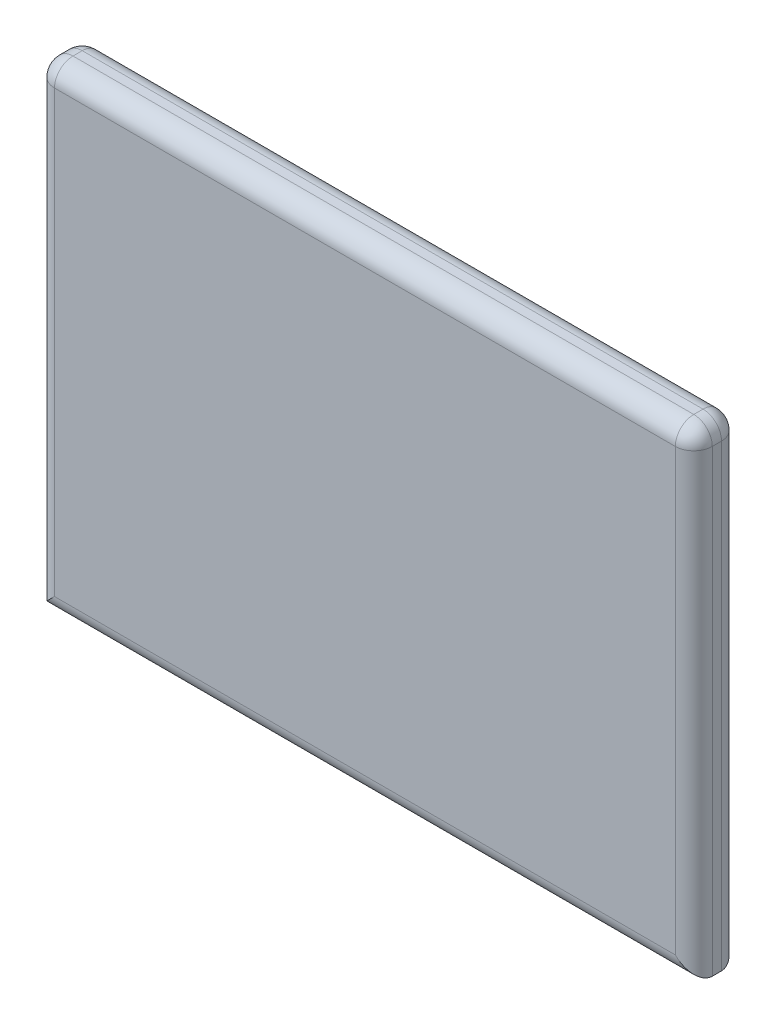
ISO-10303-21;
HEADER;
FILE_DESCRIPTION(('STEP AP214'),'2;1');
FILE_NAME('part.step','',(''),(''),'','','');
FILE_SCHEMA(('AUTOMOTIVE_DESIGN { 1 0 10303 214 1 1 1 1 }'));
ENDSEC;
DATA;
#1=APPLICATION_CONTEXT('core data for automotive mechanical design processes');
#2=APPLICATION_PROTOCOL_DEFINITION('international standard','automotive_design',2000,#1);
#3=PRODUCT_CONTEXT('',#1,'mechanical');
#4=PRODUCT('Part','Part','',(#3));
#5=PRODUCT_RELATED_PRODUCT_CATEGORY('part','',(#4));
#6=PRODUCT_DEFINITION_FORMATION('','',#4);
#7=PRODUCT_DEFINITION_CONTEXT('part definition',#1,'design');
#8=PRODUCT_DEFINITION('design','',#6,#7);
#9=PRODUCT_DEFINITION_SHAPE('','',#8);
#10=(LENGTH_UNIT() NAMED_UNIT(*) SI_UNIT(.MILLI.,.METRE.));
#11=(NAMED_UNIT(*) PLANE_ANGLE_UNIT() SI_UNIT($,.RADIAN.));
#12=(NAMED_UNIT(*) SI_UNIT($,.STERADIAN.) SOLID_ANGLE_UNIT());
#13=UNCERTAINTY_MEASURE_WITH_UNIT(LENGTH_MEASURE(1.E-05),#10,'distance_accuracy_value','');
#14=(GEOMETRIC_REPRESENTATION_CONTEXT(3) GLOBAL_UNCERTAINTY_ASSIGNED_CONTEXT((#13)) GLOBAL_UNIT_ASSIGNED_CONTEXT((#10,
#11,#12)) REPRESENTATION_CONTEXT('',''));
#15=CARTESIAN_POINT('',(0.,0.,0.));
#16=DIRECTION('',(0.,0.,1.));
#17=DIRECTION('',(1.,0.,0.));
#18=AXIS2_PLACEMENT_3D('',#15,#16,#17);
#19=CARTESIAN_POINT('',(-178.,-129.17,25.));
#20=DIRECTION('',(0.,1.,0.));
#21=DIRECTION('',(-1.,0.,0.));
#22=AXIS2_PLACEMENT_3D('',#19,#20,#21);
#23=PLANE('',#22);
#24=DIRECTION('',(1.,0.,0.));
#25=VECTOR('',#24,1.);
#26=CARTESIAN_POINT('',(-178.,-129.17,10.));
#27=LINE('',#26,#25);
#28=CARTESIAN_POINT('',(-178.,-129.17,10.));
#29=VERTEX_POINT('',#28);
#30=CARTESIAN_POINT('',(-100.,-129.17,10.));
#31=VERTEX_POINT('',#30);
#32=EDGE_CURVE('E336',#29,#31,#27,.T.);
#33=ORIENTED_EDGE('',*,*,#32,.T.);
#34=DIRECTION('',(0.,0.,-1.));
#35=VECTOR('',#34,1.);
#36=CARTESIAN_POINT('',(-100.,-129.17,16.5));
#37=LINE('',#36,#35);
#38=CARTESIAN_POINT('',(-100.,-129.17,15.));
#39=VERTEX_POINT('',#38);
#40=EDGE_CURVE('E215',#39,#31,#37,.T.);
#41=ORIENTED_EDGE('',*,*,#40,.F.);
#42=DIRECTION('',(1.,0.,0.));
#43=VECTOR('',#42,1.);
#44=CARTESIAN_POINT('',(-178.,-129.17,15.));
#45=LINE('',#44,#43);
#46=CARTESIAN_POINT('',(-178.,-129.17,15.));
#47=VERTEX_POINT('',#46);
#48=EDGE_CURVE('E331',#39,#47,#45,.F.);
#49=ORIENTED_EDGE('',*,*,#48,.T.);
#50=DIRECTION('',(0.,0.,-1.));
#51=VECTOR('',#50,1.);
#52=CARTESIAN_POINT('',(-178.,-129.17,25.));
#53=LINE('',#52,#51);
#54=EDGE_CURVE('E311',#47,#29,#53,.T.);
#55=ORIENTED_EDGE('',*,*,#54,.T.);
#56=EDGE_LOOP('',(#33,#41,#49,#55));
#57=FACE_BOUND('',#56,.T.);
#58=ADVANCED_FACE('F45',(#57),#23,.F.);
#59=CARTESIAN_POINT('',(-178.,129.17,25.));
#60=DIRECTION('',(1.,0.,0.));
#61=DIRECTION('',(0.,1.,0.));
#62=AXIS2_PLACEMENT_3D('',#59,#60,#61);
#63=PLANE('',#62);
#64=DIRECTION('',(0.,0.,-1.));
#65=VECTOR('',#64,1.);
#66=CARTESIAN_POINT('',(-178.,119.17,25.));
#67=LINE('',#66,#65);
#68=CARTESIAN_POINT('',(-178.,119.17,15.));
#69=VERTEX_POINT('',#68);
#70=CARTESIAN_POINT('',(-178.,119.17,10.));
#71=VERTEX_POINT('',#70);
#72=EDGE_CURVE('E357',#69,#71,#67,.T.);
#73=ORIENTED_EDGE('',*,*,#72,.T.);
#74=DIRECTION('',(0.,-1.,0.));
#75=VECTOR('',#74,1.);
#76=CARTESIAN_POINT('',(-178.,129.17,10.));
#77=LINE('',#76,#75);
#78=EDGE_CURVE('E361',#71,#29,#77,.T.);
#79=ORIENTED_EDGE('',*,*,#78,.T.);
#80=ORIENTED_EDGE('',*,*,#54,.F.);
#81=DIRECTION('',(0.,-1.,0.));
#82=VECTOR('',#81,1.);
#83=CARTESIAN_POINT('',(-178.,129.17,15.));
#84=LINE('',#83,#82);
#85=EDGE_CURVE('E359',#47,#69,#84,.F.);
#86=ORIENTED_EDGE('',*,*,#85,.T.);
#87=EDGE_LOOP('',(#73,#79,#80,#86));
#88=FACE_BOUND('',#87,.T.);
#89=ADVANCED_FACE('F465',(#88),#63,.F.);
#90=CARTESIAN_POINT('',(178.,-129.17,15.));
#91=VERTEX_POINT('',#90);
#92=CARTESIAN_POINT('',(100.,-129.17,15.));
#93=VERTEX_POINT('',#92);
#94=EDGE_CURVE('E332',#91,#93,#45,.F.);
#95=ORIENTED_EDGE('',*,*,#94,.T.);
#96=DIRECTION('',(0.,0.,1.));
#97=VECTOR('',#96,1.);
#98=CARTESIAN_POINT('',(100.,-129.17,16.5));
#99=LINE('',#98,#97);
#100=CARTESIAN_POINT('',(100.,-129.17,10.));
#101=VERTEX_POINT('',#100);
#102=EDGE_CURVE('E213',#101,#93,#99,.T.);
#103=ORIENTED_EDGE('',*,*,#102,.F.);
#104=CARTESIAN_POINT('',(178.,-129.17,10.));
#105=VERTEX_POINT('',#104);
#106=EDGE_CURVE('E335',#101,#105,#27,.T.);
#107=ORIENTED_EDGE('',*,*,#106,.T.);
#108=DIRECTION('',(0.,0.,-1.));
#109=VECTOR('',#108,1.);
#110=CARTESIAN_POINT('',(178.,-129.17,25.));
#111=LINE('',#110,#109);
#112=EDGE_CURVE('E308',#91,#105,#111,.T.);
#113=ORIENTED_EDGE('',*,*,#112,.F.);
#114=EDGE_LOOP('',(#95,#103,#107,#113));
#115=FACE_BOUND('',#114,.T.);
#116=ADVANCED_FACE('F418',(#115),#23,.F.);
#117=CARTESIAN_POINT('',(178.,129.17,25.));
#118=DIRECTION('',(-1.,0.,0.));
#119=DIRECTION('',(0.,-1.,0.));
#120=AXIS2_PLACEMENT_3D('',#117,#118,#119);
#121=PLANE('',#120);
#122=ORIENTED_EDGE('',*,*,#112,.T.);
#123=DIRECTION('',(0.,1.,0.));
#124=VECTOR('',#123,1.);
#125=CARTESIAN_POINT('',(178.,129.17,10.));
#126=LINE('',#125,#124);
#127=CARTESIAN_POINT('',(178.,119.17,10.));
#128=VERTEX_POINT('',#127);
#129=EDGE_CURVE('E319',#105,#128,#126,.T.);
#130=ORIENTED_EDGE('',*,*,#129,.T.);
#131=DIRECTION('',(0.,0.,-1.));
#132=VECTOR('',#131,1.);
#133=CARTESIAN_POINT('',(178.,119.17,25.));
#134=LINE('',#133,#132);
#135=CARTESIAN_POINT('',(178.,119.17,15.));
#136=VERTEX_POINT('',#135);
#137=EDGE_CURVE('E315',#128,#136,#134,.F.);
#138=ORIENTED_EDGE('',*,*,#137,.T.);
#139=DIRECTION('',(0.,1.,0.));
#140=VECTOR('',#139,1.);
#141=CARTESIAN_POINT('',(178.,-129.17,15.));
#142=LINE('',#141,#140);
#143=EDGE_CURVE('E317',#136,#91,#142,.F.);
#144=ORIENTED_EDGE('',*,*,#143,.T.);
#145=EDGE_LOOP('',(#122,#130,#138,#144));
#146=FACE_BOUND('',#145,.T.);
#147=ADVANCED_FACE('F430',(#146),#121,.F.);
#148=CARTESIAN_POINT('',(-178.,129.17,25.));
#149=DIRECTION('',(0.,-1.,0.));
#150=DIRECTION('',(1.,0.,0.));
#151=AXIS2_PLACEMENT_3D('',#148,#149,#150);
#152=PLANE('',#151);
#153=DIRECTION('',(-1.,0.,0.));
#154=VECTOR('',#153,1.);
#155=CARTESIAN_POINT('',(178.,129.17,15.));
#156=LINE('',#155,#154);
#157=CARTESIAN_POINT('',(-168.,129.17,15.));
#158=VERTEX_POINT('',#157);
#159=CARTESIAN_POINT('',(168.,129.17,15.));
#160=VERTEX_POINT('',#159);
#161=EDGE_CURVE('E352',#158,#160,#156,.F.);
#162=ORIENTED_EDGE('',*,*,#161,.T.);
#163=DIRECTION('',(0.,0.,-1.));
#164=VECTOR('',#163,1.);
#165=CARTESIAN_POINT('',(168.,129.17,25.));
#166=LINE('',#165,#164);
#167=CARTESIAN_POINT('',(168.,129.17,10.));
#168=VERTEX_POINT('',#167);
#169=EDGE_CURVE('E355',#160,#168,#166,.T.);
#170=ORIENTED_EDGE('',*,*,#169,.T.);
#171=DIRECTION('',(-1.,0.,0.));
#172=VECTOR('',#171,1.);
#173=CARTESIAN_POINT('',(-178.,129.17,10.));
#174=LINE('',#173,#172);
#175=CARTESIAN_POINT('',(-168.,129.17,10.));
#176=VERTEX_POINT('',#175);
#177=EDGE_CURVE('E350',#168,#176,#174,.T.);
#178=ORIENTED_EDGE('',*,*,#177,.T.);
#179=DIRECTION('',(0.,0.,-1.));
#180=VECTOR('',#179,1.);
#181=CARTESIAN_POINT('',(-168.,129.17,25.));
#182=LINE('',#181,#180);
#183=EDGE_CURVE('E348',#176,#158,#182,.F.);
#184=ORIENTED_EDGE('',*,*,#183,.T.);
#185=EDGE_LOOP('',(#162,#170,#178,#184));
#186=FACE_BOUND('',#185,.T.);
#187=ADVANCED_FACE('F509',(#186),#152,.F.);
#188=CARTESIAN_POINT('',(0.,0.,25.));
#189=DIRECTION('',(0.,0.,1.));
#190=DIRECTION('',(1.,0.,0.));
#191=AXIS2_PLACEMENT_3D('',#188,#189,#190);
#192=PLANE('',#191);
#193=DIRECTION('',(-1.,0.,0.));
#194=VECTOR('',#193,1.);
#195=CARTESIAN_POINT('',(-178.,119.17,25.));
#196=LINE('',#195,#194);
#197=CARTESIAN_POINT('',(168.,119.17,25.));
#198=VERTEX_POINT('',#197);
#199=CARTESIAN_POINT('',(-168.,119.17,25.));
#200=VERTEX_POINT('',#199);
#201=EDGE_CURVE('E341',#198,#200,#196,.T.);
#202=ORIENTED_EDGE('',*,*,#201,.T.);
#203=DIRECTION('',(0.,-1.,0.));
#204=VECTOR('',#203,1.);
#205=CARTESIAN_POINT('',(-168.,-129.17,25.));
#206=LINE('',#205,#204);
#207=CARTESIAN_POINT('',(-168.,-119.17,25.));
#208=VERTEX_POINT('',#207);
#209=EDGE_CURVE('E346',#200,#208,#206,.T.);
#210=ORIENTED_EDGE('',*,*,#209,.T.);
#211=DIRECTION('',(1.,0.,0.));
#212=VECTOR('',#211,1.);
#213=CARTESIAN_POINT('',(178.,-119.17,25.));
#214=LINE('',#213,#212);
#215=CARTESIAN_POINT('',(168.,-119.17,25.));
#216=VERTEX_POINT('',#215);
#217=EDGE_CURVE('E343',#208,#216,#214,.T.);
#218=ORIENTED_EDGE('',*,*,#217,.T.);
#219=DIRECTION('',(0.,1.,0.));
#220=VECTOR('',#219,1.);
#221=CARTESIAN_POINT('',(168.,129.17,25.));
#222=LINE('',#221,#220);
#223=EDGE_CURVE('E339',#216,#198,#222,.T.);
#224=ORIENTED_EDGE('',*,*,#223,.T.);
#225=EDGE_LOOP('',(#202,#210,#218,#224));
#226=FACE_BOUND('',#225,.T.);
#227=ADVANCED_FACE('F444',(#226),#192,.T.);
#228=CARTESIAN_POINT('',(0.,0.,0.));
#229=DIRECTION('',(0.,0.,1.));
#230=DIRECTION('',(1.,0.,0.));
#231=AXIS2_PLACEMENT_3D('',#228,#229,#230);
#232=PLANE('',#231);
#233=DIRECTION('',(1.,0.,0.));
#234=VECTOR('',#233,1.);
#235=CARTESIAN_POINT('',(-155.,101.177924122686,0.));
#236=LINE('',#235,#234);
#237=CARTESIAN_POINT('',(-155.,101.177924122686,0.));
#238=VERTEX_POINT('',#237);
#239=CARTESIAN_POINT('',(-120.,101.177924122686,0.));
#240=VERTEX_POINT('',#239);
#241=EDGE_CURVE('E68',#238,#240,#236,.T.);
#242=ORIENTED_EDGE('',*,*,#241,.F.);
#243=DIRECTION('',(0.,-1.,0.));
#244=VECTOR('',#243,1.);
#245=CARTESIAN_POINT('',(-155.,101.177924122686,0.));
#246=LINE('',#245,#244);
#247=CARTESIAN_POINT('',(-155.,79.0661254575495,0.));
#248=VERTEX_POINT('',#247);
#249=EDGE_CURVE('E777',#238,#248,#246,.T.);
#250=ORIENTED_EDGE('',*,*,#249,.T.);
#251=DIRECTION('',(1.,0.,0.));
#252=VECTOR('',#251,1.);
#253=CARTESIAN_POINT('',(-155.,79.0661254575495,0.));
#254=LINE('',#253,#252);
#255=CARTESIAN_POINT('',(-120.,79.0661254575495,0.));
#256=VERTEX_POINT('',#255);
#257=EDGE_CURVE('E789',#248,#256,#254,.T.);
#258=ORIENTED_EDGE('',*,*,#257,.T.);
#259=DIRECTION('',(0.,-1.,0.));
#260=VECTOR('',#259,1.);
#261=CARTESIAN_POINT('',(-120.,101.177924122686,0.));
#262=LINE('',#261,#260);
#263=EDGE_CURVE('E238',#240,#256,#262,.T.);
#264=ORIENTED_EDGE('',*,*,#263,.F.);
#265=EDGE_LOOP('',(#242,#250,#258,#264));
#266=FACE_BOUND('',#265,.T.);
#267=DIRECTION('',(-1.,0.,0.));
#268=VECTOR('',#267,1.);
#269=CARTESIAN_POINT('',(155.,79.0661254575495,0.));
#270=LINE('',#269,#268);
#271=CARTESIAN_POINT('',(155.,79.0661254575495,0.));
#272=VERTEX_POINT('',#271);
#273=CARTESIAN_POINT('',(120.,79.0661254575495,0.));
#274=VERTEX_POINT('',#273);
#275=EDGE_CURVE('E302',#272,#274,#270,.T.);
#276=ORIENTED_EDGE('',*,*,#275,.F.);
#277=DIRECTION('',(0.,-1.,0.));
#278=VECTOR('',#277,1.);
#279=CARTESIAN_POINT('',(155.,101.177924122686,0.));
#280=LINE('',#279,#278);
#281=CARTESIAN_POINT('',(155.,101.177924122686,0.));
#282=VERTEX_POINT('',#281);
#283=EDGE_CURVE('E277',#282,#272,#280,.T.);
#284=ORIENTED_EDGE('',*,*,#283,.F.);
#285=DIRECTION('',(-1.,0.,0.));
#286=VECTOR('',#285,1.);
#287=CARTESIAN_POINT('',(155.,101.177924122686,0.));
#288=LINE('',#287,#286);
#289=CARTESIAN_POINT('',(120.,101.177924122686,0.));
#290=VERTEX_POINT('',#289);
#291=EDGE_CURVE('E305',#282,#290,#288,.T.);
#292=ORIENTED_EDGE('',*,*,#291,.T.);
#293=DIRECTION('',(0.,-1.,0.));
#294=VECTOR('',#293,1.);
#295=CARTESIAN_POINT('',(120.,101.177924122686,0.));
#296=LINE('',#295,#294);
#297=EDGE_CURVE('E286',#290,#274,#296,.T.);
#298=ORIENTED_EDGE('',*,*,#297,.T.);
#299=EDGE_LOOP('',(#276,#284,#292,#298));
#300=FACE_BOUND('',#299,.T.);
#301=DIRECTION('',(-1.,0.,0.));
#302=VECTOR('',#301,1.);
#303=CARTESIAN_POINT('',(0.,119.17,0.));
#304=LINE('',#303,#302);
#305=CARTESIAN_POINT('',(-168.,119.17,0.));
#306=VERTEX_POINT('',#305);
#307=CARTESIAN_POINT('',(168.,119.17,0.));
#308=VERTEX_POINT('',#307);
#309=EDGE_CURVE('E324',#306,#308,#304,.F.);
#310=ORIENTED_EDGE('',*,*,#309,.T.);
#311=DIRECTION('',(0.,1.,0.));
#312=VECTOR('',#311,1.);
#313=CARTESIAN_POINT('',(168.,0.,0.));
#314=LINE('',#313,#312);
#315=CARTESIAN_POINT('',(168.,-119.17,0.));
#316=VERTEX_POINT('',#315);
#317=EDGE_CURVE('E328',#308,#316,#314,.F.);
#318=ORIENTED_EDGE('',*,*,#317,.T.);
#319=DIRECTION('',(1.,0.,0.));
#320=VECTOR('',#319,1.);
#321=CARTESIAN_POINT('',(0.,-119.17,0.));
#322=LINE('',#321,#320);
#323=CARTESIAN_POINT('',(-168.,-119.17,0.));
#324=VERTEX_POINT('',#323);
#325=EDGE_CURVE('E326',#316,#324,#322,.F.);
#326=ORIENTED_EDGE('',*,*,#325,.T.);
#327=DIRECTION('',(0.,-1.,0.));
#328=VECTOR('',#327,1.);
#329=CARTESIAN_POINT('',(-168.,0.,0.));
#330=LINE('',#329,#328);
#331=EDGE_CURVE('E322',#324,#306,#330,.F.);
#332=ORIENTED_EDGE('',*,*,#331,.T.);
#333=EDGE_LOOP('',(#310,#318,#326,#332));
#334=FACE_BOUND('',#333,.T.);
#335=ADVANCED_FACE('F475',(#266,#300,#334),#232,.F.);
#336=CARTESIAN_POINT('',(-168.,0.,15.));
#337=DIRECTION('',(0.,1.,0.));
#338=DIRECTION('',(-1.,0.,0.));
#339=AXIS2_PLACEMENT_3D('',#336,#337,#338);
#340=CYLINDRICAL_SURFACE('',#339,10.);
#341=CARTESIAN_POINT('',(-168.,119.17,15.));
#342=DIRECTION('',(0.,1.,0.));
#343=DIRECTION('',(0.,0.,1.));
#344=AXIS2_PLACEMENT_3D('',#341,#342,#343);
#345=CIRCLE('',#344,10.);
#346=EDGE_CURVE('E403',#69,#200,#345,.T.);
#347=ORIENTED_EDGE('',*,*,#346,.F.);
#348=ORIENTED_EDGE('',*,*,#85,.F.);
#349=CARTESIAN_POINT('',(-168.,-119.17,15.));
#350=DIRECTION('',(-0.707106781186548,0.707106781186547,0.));
#351=DIRECTION('',(0.707106781186547,0.707106781186548,0.));
#352=AXIS2_PLACEMENT_3D('',#349,#350,#351);
#353=ELLIPSE('',#352,14.1421356237309,10.);
#354=EDGE_CURVE('E312',#208,#47,#353,.F.);
#355=ORIENTED_EDGE('',*,*,#354,.F.);
#356=ORIENTED_EDGE('',*,*,#209,.F.);
#357=EDGE_LOOP('',(#347,#348,#355,#356));
#358=FACE_BOUND('',#357,.T.);
#359=ADVANCED_FACE('F47',(#358),#340,.T.);
#360=CARTESIAN_POINT('',(0.,-119.17,15.));
#361=DIRECTION('',(-1.,0.,0.));
#362=DIRECTION('',(0.,-1.,0.));
#363=AXIS2_PLACEMENT_3D('',#360,#361,#362);
#364=CYLINDRICAL_SURFACE('',#363,10.);
#365=CARTESIAN_POINT('',(-100.,-119.17,15.));
#366=DIRECTION('',(-1.,0.,0.));
#367=DIRECTION('',(0.,-1.,0.));
#368=AXIS2_PLACEMENT_3D('',#365,#366,#367);
#369=CIRCLE('',#368,10.);
#370=CARTESIAN_POINT('',(-100.,-129.056859966643,16.5));
#371=VERTEX_POINT('',#370);
#372=EDGE_CURVE('E229',#371,#39,#369,.F.);
#373=ORIENTED_EDGE('',*,*,#372,.F.);
#374=DIRECTION('',(-1.,0.,0.));
#375=VECTOR('',#374,1.);
#376=CARTESIAN_POINT('',(0.,-129.056859966643,16.5));
#377=LINE('',#376,#375);
#378=CARTESIAN_POINT('',(100.,-129.056859966643,16.5));
#379=VERTEX_POINT('',#378);
#380=EDGE_CURVE('E11',#379,#371,#377,.T.);
#381=ORIENTED_EDGE('',*,*,#380,.F.);
#382=CARTESIAN_POINT('',(100.,-119.17,15.));
#383=DIRECTION('',(1.,0.,0.));
#384=DIRECTION('',(0.,1.,0.));
#385=AXIS2_PLACEMENT_3D('',#382,#383,#384);
#386=CIRCLE('',#385,10.);
#387=EDGE_CURVE('E223',#93,#379,#386,.F.);
#388=ORIENTED_EDGE('',*,*,#387,.F.);
#389=ORIENTED_EDGE('',*,*,#94,.F.);
#390=CARTESIAN_POINT('',(168.,-119.17,15.));
#391=DIRECTION('',(-0.707106781186547,-0.707106781186547,0.));
#392=DIRECTION('',(0.707106781186547,-0.707106781186547,0.));
#393=AXIS2_PLACEMENT_3D('',#390,#391,#392);
#394=ELLIPSE('',#393,14.1421356237309,10.);
#395=EDGE_CURVE('E400',#216,#91,#394,.F.);
#396=ORIENTED_EDGE('',*,*,#395,.F.);
#397=ORIENTED_EDGE('',*,*,#217,.F.);
#398=ORIENTED_EDGE('',*,*,#354,.T.);
#399=ORIENTED_EDGE('',*,*,#48,.F.);
#400=EDGE_LOOP('',(#373,#381,#388,#389,#396,#397,#398,#399));
#401=FACE_BOUND('',#400,.T.);
#402=ADVANCED_FACE('F436',(#401),#364,.T.);
#403=CARTESIAN_POINT('',(-168.,119.17,15.));
#404=DIRECTION('',(0.,0.,1.));
#405=DIRECTION('',(1.,0.,0.));
#406=AXIS2_PLACEMENT_3D('',#403,#404,#405);
#407=SPHERICAL_SURFACE('',#406,10.);
#408=CARTESIAN_POINT('',(-168.,119.17,15.));
#409=DIRECTION('',(0.,0.,1.));
#410=DIRECTION('',(1.,0.,0.));
#411=AXIS2_PLACEMENT_3D('',#408,#409,#410);
#412=CIRCLE('',#411,10.);
#413=EDGE_CURVE('E394',#69,#158,#412,.F.);
#414=ORIENTED_EDGE('',*,*,#413,.F.);
#415=ORIENTED_EDGE('',*,*,#346,.T.);
#416=CARTESIAN_POINT('',(-168.,119.17,15.));
#417=DIRECTION('',(-1.,0.,0.));
#418=DIRECTION('',(0.,0.,1.));
#419=AXIS2_PLACEMENT_3D('',#416,#417,#418);
#420=CIRCLE('',#419,10.);
#421=EDGE_CURVE('E397',#158,#200,#420,.F.);
#422=ORIENTED_EDGE('',*,*,#421,.F.);
#423=EDGE_LOOP('',(#414,#415,#422));
#424=FACE_BOUND('',#423,.T.);
#425=ADVANCED_FACE('F453',(#424),#407,.T.);
#426=CARTESIAN_POINT('',(168.,0.,15.));
#427=DIRECTION('',(0.,-1.,0.));
#428=DIRECTION('',(1.,0.,0.));
#429=AXIS2_PLACEMENT_3D('',#426,#427,#428);
#430=CYLINDRICAL_SURFACE('',#429,10.);
#431=ORIENTED_EDGE('',*,*,#395,.T.);
#432=ORIENTED_EDGE('',*,*,#143,.F.);
#433=CARTESIAN_POINT('',(168.,119.17,15.));
#434=DIRECTION('',(0.,1.,0.));
#435=DIRECTION('',(0.,0.,1.));
#436=AXIS2_PLACEMENT_3D('',#433,#434,#435);
#437=CIRCLE('',#436,10.);
#438=EDGE_CURVE('E391',#198,#136,#437,.T.);
#439=ORIENTED_EDGE('',*,*,#438,.F.);
#440=ORIENTED_EDGE('',*,*,#223,.F.);
#441=EDGE_LOOP('',(#431,#432,#439,#440));
#442=FACE_BOUND('',#441,.T.);
#443=ADVANCED_FACE('F440',(#442),#430,.T.);
#444=CARTESIAN_POINT('',(0.,119.17,15.));
#445=DIRECTION('',(1.,0.,0.));
#446=DIRECTION('',(0.,1.,0.));
#447=AXIS2_PLACEMENT_3D('',#444,#445,#446);
#448=CYLINDRICAL_SURFACE('',#447,10.);
#449=ORIENTED_EDGE('',*,*,#421,.T.);
#450=ORIENTED_EDGE('',*,*,#201,.F.);
#451=CARTESIAN_POINT('',(168.,119.17,15.));
#452=DIRECTION('',(1.,0.,0.));
#453=DIRECTION('',(0.,0.,-1.));
#454=AXIS2_PLACEMENT_3D('',#451,#452,#453);
#455=CIRCLE('',#454,10.);
#456=EDGE_CURVE('E388',#160,#198,#455,.T.);
#457=ORIENTED_EDGE('',*,*,#456,.F.);
#458=ORIENTED_EDGE('',*,*,#161,.F.);
#459=EDGE_LOOP('',(#449,#450,#457,#458));
#460=FACE_BOUND('',#459,.T.);
#461=ADVANCED_FACE('F448',(#460),#448,.T.);
#462=CARTESIAN_POINT('',(-168.,119.17,25.));
#463=DIRECTION('',(0.,0.,-1.));
#464=DIRECTION('',(-1.,0.,0.));
#465=AXIS2_PLACEMENT_3D('',#462,#463,#464);
#466=CYLINDRICAL_SURFACE('',#465,10.);
#467=ORIENTED_EDGE('',*,*,#413,.T.);
#468=ORIENTED_EDGE('',*,*,#183,.F.);
#469=CARTESIAN_POINT('',(-168.,119.17,10.));
#470=DIRECTION('',(0.,0.,-1.));
#471=DIRECTION('',(-1.,0.,0.));
#472=AXIS2_PLACEMENT_3D('',#469,#470,#471);
#473=CIRCLE('',#472,10.);
#474=EDGE_CURVE('E385',#71,#176,#473,.T.);
#475=ORIENTED_EDGE('',*,*,#474,.F.);
#476=ORIENTED_EDGE('',*,*,#72,.F.);
#477=EDGE_LOOP('',(#467,#468,#475,#476));
#478=FACE_BOUND('',#477,.T.);
#479=ADVANCED_FACE('F488',(#478),#466,.T.);
#480=CARTESIAN_POINT('',(168.,119.17,15.));
#481=DIRECTION('',(0.,0.,1.));
#482=DIRECTION('',(1.,0.,0.));
#483=AXIS2_PLACEMENT_3D('',#480,#481,#482);
#484=SPHERICAL_SURFACE('',#483,10.);
#485=ORIENTED_EDGE('',*,*,#456,.T.);
#486=ORIENTED_EDGE('',*,*,#438,.T.);
#487=CARTESIAN_POINT('',(168.,119.17,15.));
#488=DIRECTION('',(0.,0.,1.));
#489=DIRECTION('',(1.,0.,0.));
#490=AXIS2_PLACEMENT_3D('',#487,#488,#489);
#491=CIRCLE('',#490,10.);
#492=EDGE_CURVE('E379',#160,#136,#491,.F.);
#493=ORIENTED_EDGE('',*,*,#492,.F.);
#494=EDGE_LOOP('',(#485,#486,#493));
#495=FACE_BOUND('',#494,.T.);
#496=ADVANCED_FACE('F485',(#495),#484,.T.);
#497=CARTESIAN_POINT('',(-168.,119.17,10.));
#498=DIRECTION('',(-1.,0.,0.));
#499=DIRECTION('',(0.,0.,1.));
#500=AXIS2_PLACEMENT_3D('',#497,#498,#499);
#501=SPHERICAL_SURFACE('',#500,10.);
#502=CARTESIAN_POINT('',(-168.,119.17,10.));
#503=DIRECTION('',(-1.,0.,0.));
#504=DIRECTION('',(0.,0.,1.));
#505=AXIS2_PLACEMENT_3D('',#502,#503,#504);
#506=CIRCLE('',#505,10.);
#507=EDGE_CURVE('E376',#306,#176,#506,.F.);
#508=ORIENTED_EDGE('',*,*,#507,.F.);
#509=CARTESIAN_POINT('',(-168.,119.17,10.));
#510=DIRECTION('',(0.,1.,0.));
#511=DIRECTION('',(0.,0.,1.));
#512=AXIS2_PLACEMENT_3D('',#509,#510,#511);
#513=CIRCLE('',#512,10.);
#514=EDGE_CURVE('E382',#71,#306,#513,.F.);
#515=ORIENTED_EDGE('',*,*,#514,.F.);
#516=ORIENTED_EDGE('',*,*,#474,.T.);
#517=EDGE_LOOP('',(#508,#515,#516));
#518=FACE_BOUND('',#517,.T.);
#519=ADVANCED_FACE('F487',(#518),#501,.T.);
#520=CARTESIAN_POINT('',(-168.,129.17,10.));
#521=DIRECTION('',(0.,-1.,0.));
#522=DIRECTION('',(1.,0.,0.));
#523=AXIS2_PLACEMENT_3D('',#520,#521,#522);
#524=CYLINDRICAL_SURFACE('',#523,10.);
#525=ORIENTED_EDGE('',*,*,#514,.T.);
#526=ORIENTED_EDGE('',*,*,#331,.F.);
#527=CARTESIAN_POINT('',(-168.,-119.17,10.));
#528=DIRECTION('',(0.707106781186548,-0.707106781186547,0.));
#529=DIRECTION('',(-0.707106781186547,-0.707106781186548,0.));
#530=AXIS2_PLACEMENT_3D('',#527,#528,#529);
#531=ELLIPSE('',#530,14.1421356237309,10.);
#532=EDGE_CURVE('E373',#29,#324,#531,.T.);
#533=ORIENTED_EDGE('',*,*,#532,.F.);
#534=ORIENTED_EDGE('',*,*,#78,.F.);
#535=EDGE_LOOP('',(#525,#526,#533,#534));
#536=FACE_BOUND('',#535,.T.);
#537=ADVANCED_FACE('F469',(#536),#524,.T.);
#538=CARTESIAN_POINT('',(168.,119.17,25.));
#539=DIRECTION('',(0.,0.,-1.));
#540=DIRECTION('',(-1.,0.,0.));
#541=AXIS2_PLACEMENT_3D('',#538,#539,#540);
#542=CYLINDRICAL_SURFACE('',#541,10.);
#543=ORIENTED_EDGE('',*,*,#492,.T.);
#544=ORIENTED_EDGE('',*,*,#137,.F.);
#545=CARTESIAN_POINT('',(168.,119.17,10.));
#546=DIRECTION('',(0.,0.,-1.));
#547=DIRECTION('',(-1.,0.,0.));
#548=AXIS2_PLACEMENT_3D('',#545,#546,#547);
#549=CIRCLE('',#548,10.);
#550=EDGE_CURVE('E370',#168,#128,#549,.T.);
#551=ORIENTED_EDGE('',*,*,#550,.F.);
#552=ORIENTED_EDGE('',*,*,#169,.F.);
#553=EDGE_LOOP('',(#543,#544,#551,#552));
#554=FACE_BOUND('',#553,.T.);
#555=ADVANCED_FACE('F482',(#554),#542,.T.);
#556=CARTESIAN_POINT('',(-178.,119.17,10.));
#557=DIRECTION('',(-1.,0.,0.));
#558=DIRECTION('',(0.,-1.,0.));
#559=AXIS2_PLACEMENT_3D('',#556,#557,#558);
#560=CYLINDRICAL_SURFACE('',#559,10.);
#561=ORIENTED_EDGE('',*,*,#507,.T.);
#562=ORIENTED_EDGE('',*,*,#177,.F.);
#563=CARTESIAN_POINT('',(168.,119.17,10.));
#564=DIRECTION('',(1.,0.,0.));
#565=DIRECTION('',(0.,0.,-1.));
#566=AXIS2_PLACEMENT_3D('',#563,#564,#565);
#567=CIRCLE('',#566,10.);
#568=EDGE_CURVE('E367',#308,#168,#567,.T.);
#569=ORIENTED_EDGE('',*,*,#568,.F.);
#570=ORIENTED_EDGE('',*,*,#309,.F.);
#571=EDGE_LOOP('',(#561,#562,#569,#570));
#572=FACE_BOUND('',#571,.T.);
#573=ADVANCED_FACE('F588',(#572),#560,.T.);
#574=CARTESIAN_POINT('',(-178.,-119.17,10.));
#575=DIRECTION('',(1.,0.,0.));
#576=DIRECTION('',(0.,1.,0.));
#577=AXIS2_PLACEMENT_3D('',#574,#575,#576);
#578=CYLINDRICAL_SURFACE('',#577,10.);
#579=CARTESIAN_POINT('',(-100.,-119.17,10.));
#580=DIRECTION('',(-1.,0.,0.));
#581=DIRECTION('',(0.,-1.,0.));
#582=AXIS2_PLACEMENT_3D('',#579,#580,#581);
#583=CIRCLE('',#582,10.);
#584=CARTESIAN_POINT('',(-100.,-129.056859966643,8.5));
#585=VERTEX_POINT('',#584);
#586=EDGE_CURVE('E53',#31,#585,#583,.F.);
#587=ORIENTED_EDGE('',*,*,#586,.F.);
#588=ORIENTED_EDGE('',*,*,#32,.F.);
#589=ORIENTED_EDGE('',*,*,#532,.T.);
#590=ORIENTED_EDGE('',*,*,#325,.F.);
#591=CARTESIAN_POINT('',(168.,-119.17,10.));
#592=DIRECTION('',(0.707106781186547,0.707106781186547,0.));
#593=DIRECTION('',(0.707106781186547,-0.707106781186547,0.));
#594=AXIS2_PLACEMENT_3D('',#591,#592,#593);
#595=ELLIPSE('',#594,14.1421356237309,10.);
#596=EDGE_CURVE('E365',#105,#316,#595,.T.);
#597=ORIENTED_EDGE('',*,*,#596,.F.);
#598=ORIENTED_EDGE('',*,*,#106,.F.);
#599=CARTESIAN_POINT('',(100.,-119.17,10.));
#600=DIRECTION('',(1.,0.,0.));
#601=DIRECTION('',(0.,1.,0.));
#602=AXIS2_PLACEMENT_3D('',#599,#600,#601);
#603=CIRCLE('',#602,10.);
#604=CARTESIAN_POINT('',(100.,-129.056859966643,8.5));
#605=VERTEX_POINT('',#604);
#606=EDGE_CURVE('E409',#605,#101,#603,.F.);
#607=ORIENTED_EDGE('',*,*,#606,.F.);
#608=DIRECTION('',(1.,0.,0.));
#609=VECTOR('',#608,1.);
#610=CARTESIAN_POINT('',(-178.,-129.056859966643,8.5));
#611=LINE('',#610,#609);
#612=EDGE_CURVE('E363',#585,#605,#611,.T.);
#613=ORIENTED_EDGE('',*,*,#612,.F.);
#614=EDGE_LOOP('',(#587,#588,#589,#590,#597,#598,#607,#613));
#615=FACE_BOUND('',#614,.T.);
#616=ADVANCED_FACE('F422',(#615),#578,.T.);
#617=CARTESIAN_POINT('',(168.,119.17,10.));
#618=DIRECTION('',(0.,1.,0.));
#619=DIRECTION('',(0.,0.,1.));
#620=AXIS2_PLACEMENT_3D('',#617,#618,#619);
#621=SPHERICAL_SURFACE('',#620,10.);
#622=ORIENTED_EDGE('',*,*,#568,.T.);
#623=ORIENTED_EDGE('',*,*,#550,.T.);
#624=CARTESIAN_POINT('',(168.,119.17,10.));
#625=DIRECTION('',(0.,1.,0.));
#626=DIRECTION('',(0.,0.,1.));
#627=AXIS2_PLACEMENT_3D('',#624,#625,#626);
#628=CIRCLE('',#627,10.);
#629=EDGE_CURVE('E307',#308,#128,#628,.F.);
#630=ORIENTED_EDGE('',*,*,#629,.F.);
#631=EDGE_LOOP('',(#622,#623,#630));
#632=FACE_BOUND('',#631,.T.);
#633=ADVANCED_FACE('F479',(#632),#621,.T.);
#634=CARTESIAN_POINT('',(168.,129.17,10.));
#635=DIRECTION('',(0.,1.,0.));
#636=DIRECTION('',(-1.,0.,0.));
#637=AXIS2_PLACEMENT_3D('',#634,#635,#636);
#638=CYLINDRICAL_SURFACE('',#637,10.);
#639=ORIENTED_EDGE('',*,*,#596,.T.);
#640=ORIENTED_EDGE('',*,*,#317,.F.);
#641=ORIENTED_EDGE('',*,*,#629,.T.);
#642=ORIENTED_EDGE('',*,*,#129,.F.);
#643=EDGE_LOOP('',(#639,#640,#641,#642));
#644=FACE_BOUND('',#643,.T.);
#645=ADVANCED_FACE('F427',(#644),#638,.T.);
#646=CARTESIAN_POINT('',(155.,90.1220247901177,-8.01933013740716));
#647=CARTESIAN_POINT('',(155.,94.660122661416,-5.51130107781556));
#648=CARTESIAN_POINT('',(155.,104.420444483677,-8.01239078646008));
#649=CARTESIAN_POINT('',(155.,101.177924122686,0.));
#650=B_SPLINE_CURVE_WITH_KNOTS('',3,(#646,#647,#648,#649),.UNSPECIFIED.,.F.,.F.,(4,4),(0.,1.),.UNSPECIFIED.);
#651=DIRECTION('',(-1.,0.,0.));
#652=VECTOR('',#651,1.);
#653=SURFACE_OF_LINEAR_EXTRUSION('',#650,#652);
#654=CARTESIAN_POINT('',(120.,90.1220247901177,-8.01933013740716));
#655=CARTESIAN_POINT('',(120.,94.660122661416,-5.51130107781556));
#656=CARTESIAN_POINT('',(120.,104.420444483677,-8.01239078646008));
#657=CARTESIAN_POINT('',(120.,101.177924122686,0.));
#658=B_SPLINE_CURVE_WITH_KNOTS('',3,(#654,#655,#656,#657),.UNSPECIFIED.,.F.,.F.,(4,4),(0.,1.),.UNSPECIFIED.);
#659=CARTESIAN_POINT('',(120.,90.1220247901177,-8.01933013740716));
#660=VERTEX_POINT('',#659);
#661=EDGE_CURVE('E278',#660,#290,#658,.T.);
#662=ORIENTED_EDGE('',*,*,#661,.T.);
#663=ORIENTED_EDGE('',*,*,#291,.F.);
#664=CARTESIAN_POINT('',(155.,90.1220247901177,-8.01933013740716));
#665=VERTEX_POINT('',#664);
#666=EDGE_CURVE('E296',#665,#282,#650,.T.);
#667=ORIENTED_EDGE('',*,*,#666,.F.);
#668=DIRECTION('',(-1.,0.,0.));
#669=VECTOR('',#668,1.);
#670=CARTESIAN_POINT('',(155.,90.1220247901177,-8.01933013740716));
#671=LINE('',#670,#669);
#672=EDGE_CURVE('E276',#665,#660,#671,.T.);
#673=ORIENTED_EDGE('',*,*,#672,.T.);
#674=EDGE_LOOP('',(#662,#663,#667,#673));
#675=FACE_BOUND('',#674,.T.);
#676=ADVANCED_FACE('F266',(#675),#653,.F.);
#677=CARTESIAN_POINT('',(155.,79.0661254575495,0.));
#678=CARTESIAN_POINT('',(155.,75.8236050965582,-8.01239078646008));
#679=CARTESIAN_POINT('',(155.,85.5839269188194,-5.51130107781556));
#680=CARTESIAN_POINT('',(155.,90.1220247901177,-8.01933013740716));
#681=B_SPLINE_CURVE_WITH_KNOTS('',3,(#677,#678,#679,#680),.UNSPECIFIED.,.F.,.F.,(4,4),(0.,1.),.UNSPECIFIED.);
#682=DIRECTION('',(-1.,0.,0.));
#683=VECTOR('',#682,1.);
#684=SURFACE_OF_LINEAR_EXTRUSION('',#681,#683);
#685=CARTESIAN_POINT('',(120.,79.0661254575495,0.));
#686=CARTESIAN_POINT('',(120.,75.8236050965582,-8.01239078646008));
#687=CARTESIAN_POINT('',(120.,85.5839269188194,-5.51130107781556));
#688=CARTESIAN_POINT('',(120.,90.1220247901177,-8.01933013740716));
#689=B_SPLINE_CURVE_WITH_KNOTS('',3,(#685,#686,#687,#688),.UNSPECIFIED.,.F.,.F.,(4,4),(0.,1.),.UNSPECIFIED.);
#690=EDGE_CURVE('E292',#274,#660,#689,.T.);
#691=ORIENTED_EDGE('',*,*,#690,.T.);
#692=ORIENTED_EDGE('',*,*,#672,.F.);
#693=EDGE_CURVE('E270',#272,#665,#681,.T.);
#694=ORIENTED_EDGE('',*,*,#693,.F.);
#695=ORIENTED_EDGE('',*,*,#275,.T.);
#696=EDGE_LOOP('',(#691,#692,#694,#695));
#697=FACE_BOUND('',#696,.T.);
#698=ADVANCED_FACE('F258',(#697),#684,.F.);
#699=CARTESIAN_POINT('',(155.,98.5677062935104,-6.07380071627926));
#700=DIRECTION('',(1.,0.,0.));
#701=DIRECTION('',(0.,0.,-1.));
#702=AXIS2_PLACEMENT_3D('',#699,#700,#701);
#703=PLANE('',#702);
#704=ORIENTED_EDGE('',*,*,#666,.T.);
#705=ORIENTED_EDGE('',*,*,#283,.T.);
#706=ORIENTED_EDGE('',*,*,#693,.T.);
#707=EDGE_LOOP('',(#704,#705,#706));
#708=FACE_BOUND('',#707,.T.);
#709=ADVANCED_FACE('F255',(#708),#703,.T.);
#710=CARTESIAN_POINT('',(120.,98.5677062935104,-6.07380071627926));
#711=DIRECTION('',(1.,0.,0.));
#712=DIRECTION('',(0.,0.,-1.));
#713=AXIS2_PLACEMENT_3D('',#710,#711,#712);
#714=PLANE('',#713);
#715=ORIENTED_EDGE('',*,*,#661,.F.);
#716=ORIENTED_EDGE('',*,*,#690,.F.);
#717=ORIENTED_EDGE('',*,*,#297,.F.);
#718=EDGE_LOOP('',(#715,#716,#717));
#719=FACE_BOUND('',#718,.T.);
#720=ADVANCED_FACE('F252',(#719),#714,.F.);
#721=CARTESIAN_POINT('',(-155.,90.1220247901177,-8.01933013740716));
#722=CARTESIAN_POINT('',(-155.,94.660122661416,-5.51130107781556));
#723=CARTESIAN_POINT('',(-155.,104.420444483677,-8.01239078646008));
#724=CARTESIAN_POINT('',(-155.,101.177924122686,0.));
#725=B_SPLINE_CURVE_WITH_KNOTS('',3,(#721,#722,#723,#724),.UNSPECIFIED.,.F.,.F.,(4,4),(0.,1.),.UNSPECIFIED.);
#726=DIRECTION('',(1.,0.,0.));
#727=VECTOR('',#726,1.);
#728=SURFACE_OF_LINEAR_EXTRUSION('',#725,#727);
#729=CARTESIAN_POINT('',(-120.,90.1220247901177,-8.01933013740716));
#730=CARTESIAN_POINT('',(-120.,94.660122661416,-5.51130107781556));
#731=CARTESIAN_POINT('',(-120.,104.420444483677,-8.01239078646008));
#732=CARTESIAN_POINT('',(-120.,101.177924122686,0.));
#733=B_SPLINE_CURVE_WITH_KNOTS('',3,(#729,#730,#731,#732),.UNSPECIFIED.,.F.,.F.,(4,4),(0.,1.),.UNSPECIFIED.);
#734=CARTESIAN_POINT('',(-120.,90.1220247901177,-8.01933013740716));
#735=VERTEX_POINT('',#734);
#736=EDGE_CURVE('E231',#735,#240,#733,.T.);
#737=ORIENTED_EDGE('',*,*,#736,.F.);
#738=DIRECTION('',(1.,0.,0.));
#739=VECTOR('',#738,1.);
#740=CARTESIAN_POINT('',(-155.,90.1220247901177,-8.01933013740716));
#741=LINE('',#740,#739);
#742=CARTESIAN_POINT('',(-155.,90.1220247901177,-8.01933013740716));
#743=VERTEX_POINT('',#742);
#744=EDGE_CURVE('E287',#743,#735,#741,.T.);
#745=ORIENTED_EDGE('',*,*,#744,.F.);
#746=EDGE_CURVE('E232',#743,#238,#725,.T.);
#747=ORIENTED_EDGE('',*,*,#746,.T.);
#748=ORIENTED_EDGE('',*,*,#241,.T.);
#749=EDGE_LOOP('',(#737,#745,#747,#748));
#750=FACE_BOUND('',#749,.T.);
#751=ADVANCED_FACE('F247',(#750),#728,.T.);
#752=CARTESIAN_POINT('',(-155.,79.0661254575495,0.));
#753=CARTESIAN_POINT('',(-155.,75.8236050965582,-8.01239078646008));
#754=CARTESIAN_POINT('',(-155.,85.5839269188194,-5.51130107781556));
#755=CARTESIAN_POINT('',(-155.,90.1220247901177,-8.01933013740716));
#756=B_SPLINE_CURVE_WITH_KNOTS('',3,(#752,#753,#754,#755),.UNSPECIFIED.,.F.,.F.,(4,4),(0.,1.),.UNSPECIFIED.);
#757=DIRECTION('',(1.,0.,0.));
#758=VECTOR('',#757,1.);
#759=SURFACE_OF_LINEAR_EXTRUSION('',#756,#758);
#760=CARTESIAN_POINT('',(-120.,79.0661254575495,0.));
#761=CARTESIAN_POINT('',(-120.,75.8236050965582,-8.01239078646008));
#762=CARTESIAN_POINT('',(-120.,85.5839269188194,-5.51130107781556));
#763=CARTESIAN_POINT('',(-120.,90.1220247901177,-8.01933013740716));
#764=B_SPLINE_CURVE_WITH_KNOTS('',3,(#760,#761,#762,#763),.UNSPECIFIED.,.F.,.F.,(4,4),(0.,1.),.UNSPECIFIED.);
#765=EDGE_CURVE('E772',#256,#735,#764,.T.);
#766=ORIENTED_EDGE('',*,*,#765,.F.);
#767=ORIENTED_EDGE('',*,*,#257,.F.);
#768=EDGE_CURVE('E237',#248,#743,#756,.T.);
#769=ORIENTED_EDGE('',*,*,#768,.T.);
#770=ORIENTED_EDGE('',*,*,#744,.T.);
#771=EDGE_LOOP('',(#766,#767,#769,#770));
#772=FACE_BOUND('',#771,.T.);
#773=ADVANCED_FACE('F251',(#772),#759,.T.);
#774=CARTESIAN_POINT('',(-155.,98.5677062935104,-6.07380071627926));
#775=DIRECTION('',(-1.,0.,0.));
#776=DIRECTION('',(0.,0.,-1.));
#777=AXIS2_PLACEMENT_3D('',#774,#775,#776);
#778=PLANE('',#777);
#779=ORIENTED_EDGE('',*,*,#746,.F.);
#780=ORIENTED_EDGE('',*,*,#768,.F.);
#781=ORIENTED_EDGE('',*,*,#249,.F.);
#782=EDGE_LOOP('',(#779,#780,#781));
#783=FACE_BOUND('',#782,.T.);
#784=ADVANCED_FACE('F652',(#783),#778,.T.);
#785=CARTESIAN_POINT('',(-120.,98.5677062935104,-6.07380071627926));
#786=DIRECTION('',(-1.,0.,0.));
#787=DIRECTION('',(0.,0.,-1.));
#788=AXIS2_PLACEMENT_3D('',#785,#786,#787);
#789=PLANE('',#788);
#790=ORIENTED_EDGE('',*,*,#736,.T.);
#791=ORIENTED_EDGE('',*,*,#263,.T.);
#792=ORIENTED_EDGE('',*,*,#765,.T.);
#793=EDGE_LOOP('',(#790,#791,#792));
#794=FACE_BOUND('',#793,.T.);
#795=ADVANCED_FACE('F659',(#794),#789,.F.);
#796=CARTESIAN_POINT('',(-100.,-126.17,16.5));
#797=DIRECTION('',(-1.,0.,0.));
#798=DIRECTION('',(0.,-1.,0.));
#799=AXIS2_PLACEMENT_3D('',#796,#797,#798);
#800=PLANE('',#799);
#801=ORIENTED_EDGE('',*,*,#372,.T.);
#802=ORIENTED_EDGE('',*,*,#40,.T.);
#803=ORIENTED_EDGE('',*,*,#586,.T.);
#804=DIRECTION('',(0.,-1.,0.));
#805=VECTOR('',#804,1.);
#806=CARTESIAN_POINT('',(-100.,-126.17,8.5));
#807=LINE('',#806,#805);
#808=CARTESIAN_POINT('',(-100.,-126.17,8.5));
#809=VERTEX_POINT('',#808);
#810=EDGE_CURVE('E60',#809,#585,#807,.T.);
#811=ORIENTED_EDGE('',*,*,#810,.F.);
#812=DIRECTION('',(0.,0.,-1.));
#813=VECTOR('',#812,1.);
#814=CARTESIAN_POINT('',(-100.,-126.17,16.5));
#815=LINE('',#814,#813);
#816=CARTESIAN_POINT('',(-100.,-126.17,16.5));
#817=VERTEX_POINT('',#816);
#818=EDGE_CURVE('E195',#817,#809,#815,.T.);
#819=ORIENTED_EDGE('',*,*,#818,.F.);
#820=DIRECTION('',(0.,-1.,0.));
#821=VECTOR('',#820,1.);
#822=CARTESIAN_POINT('',(-100.,-126.17,16.5));
#823=LINE('',#822,#821);
#824=EDGE_CURVE('E221',#817,#371,#823,.T.);
#825=ORIENTED_EDGE('',*,*,#824,.T.);
#826=EDGE_LOOP('',(#801,#802,#803,#811,#819,#825));
#827=FACE_BOUND('',#826,.T.);
#828=ADVANCED_FACE('F192',(#827),#800,.F.);
#829=CARTESIAN_POINT('',(-100.,-126.17,16.5));
#830=DIRECTION('',(0.,0.,1.));
#831=DIRECTION('',(1.,0.,0.));
#832=AXIS2_PLACEMENT_3D('',#829,#830,#831);
#833=PLANE('',#832);
#834=ORIENTED_EDGE('',*,*,#380,.T.);
#835=ORIENTED_EDGE('',*,*,#824,.F.);
#836=DIRECTION('',(-1.,0.,0.));
#837=VECTOR('',#836,1.);
#838=CARTESIAN_POINT('',(-100.,-126.17,16.5));
#839=LINE('',#838,#837);
#840=CARTESIAN_POINT('',(100.,-126.17,16.5));
#841=VERTEX_POINT('',#840);
#842=EDGE_CURVE('E200',#841,#817,#839,.T.);
#843=ORIENTED_EDGE('',*,*,#842,.F.);
#844=DIRECTION('',(0.,-1.,0.));
#845=VECTOR('',#844,1.);
#846=CARTESIAN_POINT('',(100.,-126.17,16.5));
#847=LINE('',#846,#845);
#848=EDGE_CURVE('E224',#841,#379,#847,.T.);
#849=ORIENTED_EDGE('',*,*,#848,.T.);
#850=EDGE_LOOP('',(#834,#835,#843,#849));
#851=FACE_BOUND('',#850,.T.);
#852=ADVANCED_FACE('F673',(#851),#833,.F.);
#853=CARTESIAN_POINT('',(100.,-126.17,16.5));
#854=DIRECTION('',(1.,0.,0.));
#855=DIRECTION('',(0.,1.,0.));
#856=AXIS2_PLACEMENT_3D('',#853,#854,#855);
#857=PLANE('',#856);
#858=ORIENTED_EDGE('',*,*,#387,.T.);
#859=ORIENTED_EDGE('',*,*,#848,.F.);
#860=DIRECTION('',(0.,0.,1.));
#861=VECTOR('',#860,1.);
#862=CARTESIAN_POINT('',(100.,-126.17,16.5));
#863=LINE('',#862,#861);
#864=CARTESIAN_POINT('',(100.,-126.17,8.5));
#865=VERTEX_POINT('',#864);
#866=EDGE_CURVE('E209',#865,#841,#863,.T.);
#867=ORIENTED_EDGE('',*,*,#866,.F.);
#868=DIRECTION('',(0.,-1.,0.));
#869=VECTOR('',#868,1.);
#870=CARTESIAN_POINT('',(100.,-126.17,8.5));
#871=LINE('',#870,#869);
#872=EDGE_CURVE('E199',#865,#605,#871,.T.);
#873=ORIENTED_EDGE('',*,*,#872,.T.);
#874=ORIENTED_EDGE('',*,*,#606,.T.);
#875=ORIENTED_EDGE('',*,*,#102,.T.);
#876=EDGE_LOOP('',(#858,#859,#867,#873,#874,#875));
#877=FACE_BOUND('',#876,.T.);
#878=ADVANCED_FACE('F413',(#877),#857,.F.);
#879=CARTESIAN_POINT('',(-100.,-126.17,8.5));
#880=DIRECTION('',(0.,0.,-1.));
#881=DIRECTION('',(-1.,0.,0.));
#882=AXIS2_PLACEMENT_3D('',#879,#880,#881);
#883=PLANE('',#882);
#884=ORIENTED_EDGE('',*,*,#612,.T.);
#885=ORIENTED_EDGE('',*,*,#872,.F.);
#886=DIRECTION('',(1.,0.,0.));
#887=VECTOR('',#886,1.);
#888=CARTESIAN_POINT('',(-100.,-126.17,8.5));
#889=LINE('',#888,#887);
#890=EDGE_CURVE('E203',#809,#865,#889,.T.);
#891=ORIENTED_EDGE('',*,*,#890,.F.);
#892=ORIENTED_EDGE('',*,*,#810,.T.);
#893=EDGE_LOOP('',(#884,#885,#891,#892));
#894=FACE_BOUND('',#893,.T.);
#895=ADVANCED_FACE('F204',(#894),#883,.F.);
#896=CARTESIAN_POINT('',(0.,-126.17,0.));
#897=DIRECTION('',(0.,-1.,0.));
#898=DIRECTION('',(1.,0.,0.));
#899=AXIS2_PLACEMENT_3D('',#896,#897,#898);
#900=PLANE('',#899);
#901=ORIENTED_EDGE('',*,*,#818,.T.);
#902=ORIENTED_EDGE('',*,*,#890,.T.);
#903=ORIENTED_EDGE('',*,*,#866,.T.);
#904=ORIENTED_EDGE('',*,*,#842,.T.);
#905=EDGE_LOOP('',(#901,#902,#903,#904));
#906=FACE_BOUND('',#905,.T.);
#907=ADVANCED_FACE('F211',(#906),#900,.T.);
#908=CLOSED_SHELL('',(#58,#89,#116,#147,#187,#227,#335,#359,#402,#425,#443,#461,#479,#496,#519,
#537,#555,#573,#616,#633,#645,#676,#698,#709,#720,#751,#773,#784,#795,#828,#852,#878,#895,#907));
#909=MANIFOLD_SOLID_BREP('B2',#908);
#910=ADVANCED_BREP_SHAPE_REPRESENTATION('',(#18,#909),#14);
#911=SHAPE_DEFINITION_REPRESENTATION(#9,#910);
ENDSEC;
END-ISO-10303-21;
